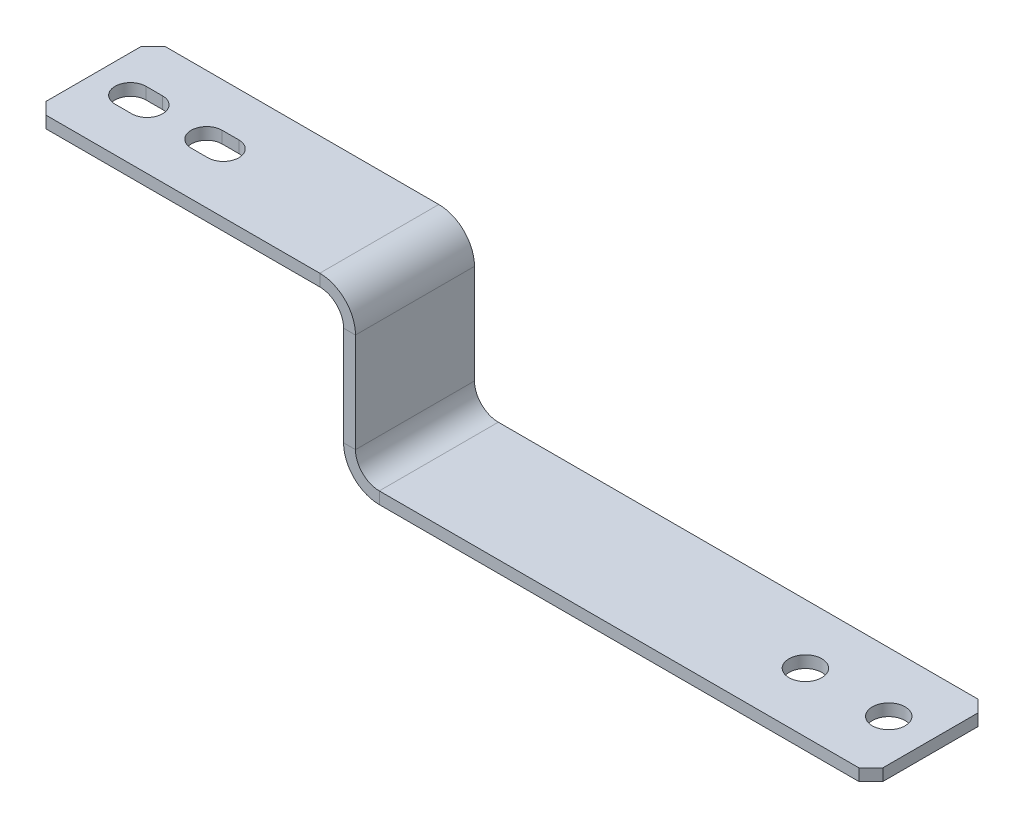
ISO-10303-21;
HEADER;
FILE_DESCRIPTION(('STEP AP214'),'2;1');
FILE_NAME('part.step','',(''),(''),'','','');
FILE_SCHEMA(('AUTOMOTIVE_DESIGN { 1 0 10303 214 1 1 1 1 }'));
ENDSEC;
DATA;
#1=APPLICATION_CONTEXT('core data for automotive mechanical design processes');
#2=APPLICATION_PROTOCOL_DEFINITION('international standard','automotive_design',2000,#1);
#3=PRODUCT_CONTEXT('',#1,'mechanical');
#4=PRODUCT('Part','Part','',(#3));
#5=PRODUCT_RELATED_PRODUCT_CATEGORY('part','',(#4));
#6=PRODUCT_DEFINITION_FORMATION('','',#4);
#7=PRODUCT_DEFINITION_CONTEXT('part definition',#1,'design');
#8=PRODUCT_DEFINITION('design','',#6,#7);
#9=PRODUCT_DEFINITION_SHAPE('','',#8);
#10=(LENGTH_UNIT() NAMED_UNIT(*) SI_UNIT(.MILLI.,.METRE.));
#11=(NAMED_UNIT(*) PLANE_ANGLE_UNIT() SI_UNIT($,.RADIAN.));
#12=(NAMED_UNIT(*) SI_UNIT($,.STERADIAN.) SOLID_ANGLE_UNIT());
#13=UNCERTAINTY_MEASURE_WITH_UNIT(LENGTH_MEASURE(1.E-05),#10,'distance_accuracy_value','');
#14=(GEOMETRIC_REPRESENTATION_CONTEXT(3) GLOBAL_UNCERTAINTY_ASSIGNED_CONTEXT((#13)) GLOBAL_UNIT_ASSIGNED_CONTEXT((#10,
#11,#12)) REPRESENTATION_CONTEXT('',''));
#15=CARTESIAN_POINT('',(0.,0.,0.));
#16=DIRECTION('',(0.,0.,1.));
#17=DIRECTION('',(1.,0.,0.));
#18=AXIS2_PLACEMENT_3D('',#15,#16,#17);
#19=CARTESIAN_POINT('',(-221.5,15.,50.));
#20=DIRECTION('',(0.,0.,1.));
#21=DIRECTION('',(1.,0.,0.));
#22=AXIS2_PLACEMENT_3D('',#19,#20,#21);
#23=PLANE('',#22);
#24=DIRECTION('',(1.,0.,0.));
#25=VECTOR('',#24,1.);
#26=CARTESIAN_POINT('',(-221.5,15.,50.));
#27=LINE('',#26,#25);
#28=CARTESIAN_POINT('',(-221.5,15.,50.));
#29=VERTEX_POINT('',#28);
#30=CARTESIAN_POINT('',(-216.5,15.,50.));
#31=VERTEX_POINT('',#30);
#32=EDGE_CURVE('E385',#29,#31,#27,.T.);
#33=ORIENTED_EDGE('',*,*,#32,.F.);
#34=CARTESIAN_POINT('',(-206.5,15.,50.));
#35=DIRECTION('',(0.,0.,1.));
#36=DIRECTION('',(1.,0.,0.));
#37=AXIS2_PLACEMENT_3D('',#34,#35,#36);
#38=CIRCLE('',#37,15.);
#39=CARTESIAN_POINT('',(-206.5,0.,50.));
#40=VERTEX_POINT('',#39);
#41=EDGE_CURVE('E308',#29,#40,#38,.T.);
#42=ORIENTED_EDGE('',*,*,#41,.T.);
#43=DIRECTION('',(0.,-1.,0.));
#44=VECTOR('',#43,1.);
#45=CARTESIAN_POINT('',(-206.5,4.99999999999997,50.));
#46=LINE('',#45,#44);
#47=CARTESIAN_POINT('',(-206.5,4.99999999999997,50.));
#48=VERTEX_POINT('',#47);
#49=EDGE_CURVE('E383',#48,#40,#46,.T.);
#50=ORIENTED_EDGE('',*,*,#49,.F.);
#51=CARTESIAN_POINT('',(-206.5,15.,50.));
#52=DIRECTION('',(0.,0.,1.));
#53=DIRECTION('',(1.,0.,0.));
#54=AXIS2_PLACEMENT_3D('',#51,#52,#53);
#55=CIRCLE('',#54,10.);
#56=EDGE_CURVE('E289',#31,#48,#55,.T.);
#57=ORIENTED_EDGE('',*,*,#56,.F.);
#58=EDGE_LOOP('',(#33,#42,#50,#57));
#59=FACE_BOUND('',#58,.T.);
#60=ADVANCED_FACE('F45',(#59),#23,.T.);
#61=CARTESIAN_POINT('',(-206.5,4.99999999999997,50.));
#62=DIRECTION('',(0.,0.,1.));
#63=DIRECTION('',(1.,0.,0.));
#64=AXIS2_PLACEMENT_3D('',#61,#62,#63);
#65=PLANE('',#64);
#66=DIRECTION('',(0.,-1.,0.));
#67=VECTOR('',#66,1.);
#68=CARTESIAN_POINT('',(-221.5,0.,50.));
#69=LINE('',#68,#67);
#70=CARTESIAN_POINT('',(-221.5,56.7,50.));
#71=VERTEX_POINT('',#70);
#72=EDGE_CURVE('E305',#71,#29,#69,.T.);
#73=ORIENTED_EDGE('',*,*,#72,.T.);
#74=ORIENTED_EDGE('',*,*,#32,.T.);
#75=DIRECTION('',(0.,1.,0.));
#76=VECTOR('',#75,1.);
#77=CARTESIAN_POINT('',(-216.5,0.,50.));
#78=LINE('',#77,#76);
#79=CARTESIAN_POINT('',(-216.5,56.7,50.));
#80=VERTEX_POINT('',#79);
#81=EDGE_CURVE('E292',#80,#31,#78,.F.);
#82=ORIENTED_EDGE('',*,*,#81,.F.);
#83=DIRECTION('',(-1.,0.,0.));
#84=VECTOR('',#83,1.);
#85=CARTESIAN_POINT('',(-216.5,56.7,50.));
#86=LINE('',#85,#84);
#87=EDGE_CURVE('E374',#80,#71,#86,.T.);
#88=ORIENTED_EDGE('',*,*,#87,.T.);
#89=EDGE_LOOP('',(#73,#74,#82,#88));
#90=FACE_BOUND('',#89,.T.);
#91=ADVANCED_FACE('F490',(#90),#65,.T.);
#92=CARTESIAN_POINT('',(-206.5,0.,0.));
#93=DIRECTION('',(0.,0.,-1.));
#94=DIRECTION('',(-1.,0.,0.));
#95=AXIS2_PLACEMENT_3D('',#92,#93,#94);
#96=PLANE('',#95);
#97=DIRECTION('',(0.,1.,0.));
#98=VECTOR('',#97,1.);
#99=CARTESIAN_POINT('',(-206.5,0.,0.));
#100=LINE('',#99,#98);
#101=CARTESIAN_POINT('',(-206.5,0.,0.));
#102=VERTEX_POINT('',#101);
#103=CARTESIAN_POINT('',(-206.5,4.99999999999997,0.));
#104=VERTEX_POINT('',#103);
#105=EDGE_CURVE('E381',#102,#104,#100,.T.);
#106=ORIENTED_EDGE('',*,*,#105,.F.);
#107=CARTESIAN_POINT('',(-206.5,15.,0.));
#108=DIRECTION('',(0.,0.,1.));
#109=DIRECTION('',(1.,0.,0.));
#110=AXIS2_PLACEMENT_3D('',#107,#108,#109);
#111=CIRCLE('',#110,15.);
#112=CARTESIAN_POINT('',(-221.5,15.,0.));
#113=VERTEX_POINT('',#112);
#114=EDGE_CURVE('E286',#113,#102,#111,.T.);
#115=ORIENTED_EDGE('',*,*,#114,.F.);
#116=DIRECTION('',(-1.,0.,0.));
#117=VECTOR('',#116,1.);
#118=CARTESIAN_POINT('',(-216.5,15.,0.));
#119=LINE('',#118,#117);
#120=CARTESIAN_POINT('',(-216.5,15.,0.));
#121=VERTEX_POINT('',#120);
#122=EDGE_CURVE('E379',#121,#113,#119,.T.);
#123=ORIENTED_EDGE('',*,*,#122,.F.);
#124=CARTESIAN_POINT('',(-206.5,15.,0.));
#125=DIRECTION('',(0.,0.,1.));
#126=DIRECTION('',(1.,0.,0.));
#127=AXIS2_PLACEMENT_3D('',#124,#125,#126);
#128=CIRCLE('',#127,10.);
#129=EDGE_CURVE('E317',#121,#104,#128,.T.);
#130=ORIENTED_EDGE('',*,*,#129,.T.);
#131=EDGE_LOOP('',(#106,#115,#123,#130));
#132=FACE_BOUND('',#131,.T.);
#133=ADVANCED_FACE('F477',(#132),#96,.T.);
#134=CARTESIAN_POINT('',(-216.5,15.,0.));
#135=DIRECTION('',(0.,0.,-1.));
#136=DIRECTION('',(-1.,0.,0.));
#137=AXIS2_PLACEMENT_3D('',#134,#135,#136);
#138=PLANE('',#137);
#139=DIRECTION('',(1.,0.,0.));
#140=VECTOR('',#139,1.);
#141=CARTESIAN_POINT('',(-221.5,4.99999999999997,0.));
#142=LINE('',#141,#140);
#143=CARTESIAN_POINT('',(-5.00000000000003,5.,0.));
#144=VERTEX_POINT('',#143);
#145=EDGE_CURVE('E314',#104,#144,#142,.T.);
#146=ORIENTED_EDGE('',*,*,#145,.T.);
#147=DIRECTION('',(0.,-1.,0.));
#148=VECTOR('',#147,1.);
#149=CARTESIAN_POINT('',(-5.00000000000003,15.,0.));
#150=LINE('',#149,#148);
#151=CARTESIAN_POINT('',(-5.00000000000003,0.,0.));
#152=VERTEX_POINT('',#151);
#153=EDGE_CURVE('E387',#144,#152,#150,.T.);
#154=ORIENTED_EDGE('',*,*,#153,.T.);
#155=DIRECTION('',(1.,0.,0.));
#156=VECTOR('',#155,1.);
#157=CARTESIAN_POINT('',(-221.5,0.,0.));
#158=LINE('',#157,#156);
#159=EDGE_CURVE('E281',#102,#152,#158,.T.);
#160=ORIENTED_EDGE('',*,*,#159,.F.);
#161=ORIENTED_EDGE('',*,*,#105,.T.);
#162=EDGE_LOOP('',(#146,#154,#160,#161));
#163=FACE_BOUND('',#162,.T.);
#164=ADVANCED_FACE('F494',(#163),#138,.T.);
#165=CARTESIAN_POINT('',(-231.5,66.7,50.));
#166=DIRECTION('',(0.,0.,1.));
#167=DIRECTION('',(1.,0.,0.));
#168=AXIS2_PLACEMENT_3D('',#165,#166,#167);
#169=PLANE('',#168);
#170=DIRECTION('',(0.,1.,0.));
#171=VECTOR('',#170,1.);
#172=CARTESIAN_POINT('',(-231.5,66.7,50.));
#173=LINE('',#172,#171);
#174=CARTESIAN_POINT('',(-231.5,66.7,50.));
#175=VERTEX_POINT('',#174);
#176=CARTESIAN_POINT('',(-231.5,71.7,50.));
#177=VERTEX_POINT('',#176);
#178=EDGE_CURVE('E376',#175,#177,#173,.T.);
#179=ORIENTED_EDGE('',*,*,#178,.F.);
#180=CARTESIAN_POINT('',(-231.5,56.7,50.));
#181=DIRECTION('',(0.,0.,-1.));
#182=DIRECTION('',(-1.,0.,0.));
#183=AXIS2_PLACEMENT_3D('',#180,#181,#182);
#184=CIRCLE('',#183,10.);
#185=EDGE_CURVE('E302',#175,#71,#184,.T.);
#186=ORIENTED_EDGE('',*,*,#185,.T.);
#187=ORIENTED_EDGE('',*,*,#87,.F.);
#188=CARTESIAN_POINT('',(-231.5,56.7,50.));
#189=DIRECTION('',(0.,0.,1.));
#190=DIRECTION('',(1.,0.,0.));
#191=AXIS2_PLACEMENT_3D('',#188,#189,#190);
#192=CIRCLE('',#191,15.);
#193=EDGE_CURVE('E295',#177,#80,#192,.F.);
#194=ORIENTED_EDGE('',*,*,#193,.F.);
#195=EDGE_LOOP('',(#179,#186,#187,#194));
#196=FACE_BOUND('',#195,.T.);
#197=ADVANCED_FACE('F492',(#196),#169,.T.);
#198=CARTESIAN_POINT('',(-216.5,56.7,50.));
#199=DIRECTION('',(0.,0.,1.));
#200=DIRECTION('',(1.,0.,0.));
#201=AXIS2_PLACEMENT_3D('',#198,#199,#200);
#202=PLANE('',#201);
#203=DIRECTION('',(1.,0.,0.));
#204=VECTOR('',#203,1.);
#205=CARTESIAN_POINT('',(-221.5,71.7,50.));
#206=LINE('',#205,#204);
#207=CARTESIAN_POINT('',(-346.5,71.7,50.));
#208=VERTEX_POINT('',#207);
#209=EDGE_CURVE('E298',#208,#177,#206,.T.);
#210=ORIENTED_EDGE('',*,*,#209,.F.);
#211=DIRECTION('',(0.,-1.,0.));
#212=VECTOR('',#211,1.);
#213=CARTESIAN_POINT('',(-346.5,56.7,50.));
#214=LINE('',#213,#212);
#215=CARTESIAN_POINT('',(-346.5,66.7,50.));
#216=VERTEX_POINT('',#215);
#217=EDGE_CURVE('E53',#208,#216,#214,.T.);
#218=ORIENTED_EDGE('',*,*,#217,.T.);
#219=DIRECTION('',(1.,0.,0.));
#220=VECTOR('',#219,1.);
#221=CARTESIAN_POINT('',(-221.5,66.7,50.));
#222=LINE('',#221,#220);
#223=EDGE_CURVE('E300',#216,#175,#222,.T.);
#224=ORIENTED_EDGE('',*,*,#223,.T.);
#225=ORIENTED_EDGE('',*,*,#178,.T.);
#226=EDGE_LOOP('',(#210,#218,#224,#225));
#227=FACE_BOUND('',#226,.T.);
#228=ADVANCED_FACE('F426',(#227),#202,.T.);
#229=CARTESIAN_POINT('',(-221.5,56.7,0.));
#230=DIRECTION('',(0.,0.,-1.));
#231=DIRECTION('',(-1.,0.,0.));
#232=AXIS2_PLACEMENT_3D('',#229,#230,#231);
#233=PLANE('',#232);
#234=DIRECTION('',(1.,0.,0.));
#235=VECTOR('',#234,1.);
#236=CARTESIAN_POINT('',(-221.5,56.7,0.));
#237=LINE('',#236,#235);
#238=CARTESIAN_POINT('',(-221.5,56.7,0.));
#239=VERTEX_POINT('',#238);
#240=CARTESIAN_POINT('',(-216.5,56.7,0.));
#241=VERTEX_POINT('',#240);
#242=EDGE_CURVE('E372',#239,#241,#237,.T.);
#243=ORIENTED_EDGE('',*,*,#242,.F.);
#244=CARTESIAN_POINT('',(-231.5,56.7,0.));
#245=DIRECTION('',(0.,0.,-1.));
#246=DIRECTION('',(-1.,0.,0.));
#247=AXIS2_PLACEMENT_3D('',#244,#245,#246);
#248=CIRCLE('',#247,10.);
#249=CARTESIAN_POINT('',(-231.5,66.7,0.));
#250=VERTEX_POINT('',#249);
#251=EDGE_CURVE('E330',#250,#239,#248,.T.);
#252=ORIENTED_EDGE('',*,*,#251,.F.);
#253=DIRECTION('',(0.,-1.,0.));
#254=VECTOR('',#253,1.);
#255=CARTESIAN_POINT('',(-231.5,71.7,0.));
#256=LINE('',#255,#254);
#257=CARTESIAN_POINT('',(-231.5,71.7,0.));
#258=VERTEX_POINT('',#257);
#259=EDGE_CURVE('E369',#258,#250,#256,.T.);
#260=ORIENTED_EDGE('',*,*,#259,.F.);
#261=CARTESIAN_POINT('',(-231.5,56.7,0.));
#262=DIRECTION('',(0.,0.,1.));
#263=DIRECTION('',(1.,0.,0.));
#264=AXIS2_PLACEMENT_3D('',#261,#262,#263);
#265=CIRCLE('',#264,15.);
#266=EDGE_CURVE('E323',#258,#241,#265,.F.);
#267=ORIENTED_EDGE('',*,*,#266,.T.);
#268=EDGE_LOOP('',(#243,#252,#260,#267));
#269=FACE_BOUND('',#268,.T.);
#270=ADVANCED_FACE('F455',(#269),#233,.T.);
#271=CARTESIAN_POINT('',(-231.5,71.7,0.));
#272=DIRECTION('',(0.,0.,-1.));
#273=DIRECTION('',(-1.,0.,0.));
#274=AXIS2_PLACEMENT_3D('',#271,#272,#273);
#275=PLANE('',#274);
#276=DIRECTION('',(0.,-1.,0.));
#277=VECTOR('',#276,1.);
#278=CARTESIAN_POINT('',(-221.5,0.,0.));
#279=LINE('',#278,#277);
#280=EDGE_CURVE('E333',#239,#113,#279,.T.);
#281=ORIENTED_EDGE('',*,*,#280,.F.);
#282=ORIENTED_EDGE('',*,*,#242,.T.);
#283=DIRECTION('',(0.,1.,0.));
#284=VECTOR('',#283,1.);
#285=CARTESIAN_POINT('',(-216.5,0.,0.));
#286=LINE('',#285,#284);
#287=EDGE_CURVE('E320',#241,#121,#286,.F.);
#288=ORIENTED_EDGE('',*,*,#287,.T.);
#289=ORIENTED_EDGE('',*,*,#122,.T.);
#290=EDGE_LOOP('',(#281,#282,#288,#289));
#291=FACE_BOUND('',#290,.T.);
#292=ADVANCED_FACE('F459',(#291),#275,.T.);
#293=CARTESIAN_POINT('',(-221.5,0.,50.));
#294=DIRECTION('',(0.,1.,0.));
#295=DIRECTION('',(-1.,0.,0.));
#296=AXIS2_PLACEMENT_3D('',#293,#294,#295);
#297=PLANE('',#296);
#298=CARTESIAN_POINT('',(-17.5,0.,25.));
#299=DIRECTION('',(0.,1.,0.));
#300=DIRECTION('',(-1.,0.,0.));
#301=AXIS2_PLACEMENT_3D('',#298,#299,#300);
#302=CIRCLE('',#301,6.90000000000001);
#303=CARTESIAN_POINT('',(-24.4,0.,25.));
#304=VERTEX_POINT('',#303);
#305=EDGE_CURVE('E278',#304,#304,#302,.T.);
#306=ORIENTED_EDGE('',*,*,#305,.T.);
#307=EDGE_LOOP('',(#306));
#308=FACE_BOUND('',#307,.T.);
#309=CARTESIAN_POINT('',(-52.5,0.,25.));
#310=DIRECTION('',(0.,1.,0.));
#311=DIRECTION('',(-1.,0.,0.));
#312=AXIS2_PLACEMENT_3D('',#309,#310,#311);
#313=CIRCLE('',#312,6.90000000000001);
#314=CARTESIAN_POINT('',(-59.4,0.,25.));
#315=VERTEX_POINT('',#314);
#316=EDGE_CURVE('E273',#315,#315,#313,.T.);
#317=ORIENTED_EDGE('',*,*,#316,.T.);
#318=EDGE_LOOP('',(#317));
#319=FACE_BOUND('',#318,.T.);
#320=DIRECTION('',(0.,0.,-1.));
#321=VECTOR('',#320,1.);
#322=CARTESIAN_POINT('',(0.,0.,50.));
#323=LINE('',#322,#321);
#324=CARTESIAN_POINT('',(0.,0.,45.));
#325=VERTEX_POINT('',#324);
#326=CARTESIAN_POINT('',(0.,0.,5.00000000000003));
#327=VERTEX_POINT('',#326);
#328=EDGE_CURVE('E367',#325,#327,#323,.T.);
#329=ORIENTED_EDGE('',*,*,#328,.F.);
#330=DIRECTION('',(0.707106781186548,0.,-0.707106781186548));
#331=VECTOR('',#330,1.);
#332=CARTESIAN_POINT('',(0.,0.,45.));
#333=LINE('',#332,#331);
#334=CARTESIAN_POINT('',(-5.00000000000003,0.,50.));
#335=VERTEX_POINT('',#334);
#336=EDGE_CURVE('E401',#325,#335,#333,.F.);
#337=ORIENTED_EDGE('',*,*,#336,.T.);
#338=DIRECTION('',(1.,0.,0.));
#339=VECTOR('',#338,1.);
#340=CARTESIAN_POINT('',(-221.5,0.,50.));
#341=LINE('',#340,#339);
#342=EDGE_CURVE('E282',#40,#335,#341,.T.);
#343=ORIENTED_EDGE('',*,*,#342,.F.);
#344=DIRECTION('',(0.,0.,-1.));
#345=VECTOR('',#344,1.);
#346=CARTESIAN_POINT('',(-206.5,0.,50.));
#347=LINE('',#346,#345);
#348=EDGE_CURVE('E311',#40,#102,#347,.T.);
#349=ORIENTED_EDGE('',*,*,#348,.T.);
#350=ORIENTED_EDGE('',*,*,#159,.T.);
#351=DIRECTION('',(-0.707106781186548,0.,-0.707106781186548));
#352=VECTOR('',#351,1.);
#353=CARTESIAN_POINT('',(-5.00000000000003,0.,0.));
#354=LINE('',#353,#352);
#355=EDGE_CURVE('E390',#152,#327,#354,.F.);
#356=ORIENTED_EDGE('',*,*,#355,.T.);
#357=EDGE_LOOP('',(#329,#337,#343,#349,#350,#356));
#358=FACE_BOUND('',#357,.T.);
#359=ADVANCED_FACE('F581',(#308,#319,#358),#297,.F.);
#360=CARTESIAN_POINT('',(0.,5.,50.));
#361=DIRECTION('',(1.,0.,0.));
#362=DIRECTION('',(0.,0.,-1.));
#363=AXIS2_PLACEMENT_3D('',#360,#361,#362);
#364=PLANE('',#363);
#365=DIRECTION('',(0.,0.,-1.));
#366=VECTOR('',#365,1.);
#367=CARTESIAN_POINT('',(0.,5.,50.));
#368=LINE('',#367,#366);
#369=CARTESIAN_POINT('',(0.,5.,45.));
#370=VERTEX_POINT('',#369);
#371=CARTESIAN_POINT('',(0.,5.,5.00000000000003));
#372=VERTEX_POINT('',#371);
#373=EDGE_CURVE('E365',#370,#372,#368,.T.);
#374=ORIENTED_EDGE('',*,*,#373,.F.);
#375=DIRECTION('',(0.,-1.,0.));
#376=VECTOR('',#375,1.);
#377=CARTESIAN_POINT('',(0.,5.,45.));
#378=LINE('',#377,#376);
#379=EDGE_CURVE('E398',#370,#325,#378,.T.);
#380=ORIENTED_EDGE('',*,*,#379,.T.);
#381=ORIENTED_EDGE('',*,*,#328,.T.);
#382=DIRECTION('',(0.,1.,0.));
#383=VECTOR('',#382,1.);
#384=CARTESIAN_POINT('',(0.,5.,5.00000000000003));
#385=LINE('',#384,#383);
#386=EDGE_CURVE('E393',#327,#372,#385,.T.);
#387=ORIENTED_EDGE('',*,*,#386,.T.);
#388=EDGE_LOOP('',(#374,#380,#381,#387));
#389=FACE_BOUND('',#388,.T.);
#390=ADVANCED_FACE('F577',(#389),#364,.T.);
#391=CARTESIAN_POINT('',(-221.5,4.99999999999997,50.));
#392=DIRECTION('',(0.,1.,0.));
#393=DIRECTION('',(-1.,0.,0.));
#394=AXIS2_PLACEMENT_3D('',#391,#392,#393);
#395=PLANE('',#394);
#396=CARTESIAN_POINT('',(-17.5,5.,25.));
#397=DIRECTION('',(0.,1.,0.));
#398=DIRECTION('',(0.,0.,1.));
#399=AXIS2_PLACEMENT_3D('',#396,#397,#398);
#400=CIRCLE('',#399,6.90000000000001);
#401=CARTESIAN_POINT('',(-17.5,5.,31.9));
#402=VERTEX_POINT('',#401);
#403=EDGE_CURVE('E270',#402,#402,#400,.T.);
#404=ORIENTED_EDGE('',*,*,#403,.F.);
#405=EDGE_LOOP('',(#404));
#406=FACE_BOUND('',#405,.T.);
#407=CARTESIAN_POINT('',(-52.5,5.,25.));
#408=DIRECTION('',(0.,1.,0.));
#409=DIRECTION('',(0.,0.,1.));
#410=AXIS2_PLACEMENT_3D('',#407,#408,#409);
#411=CIRCLE('',#410,6.90000000000001);
#412=CARTESIAN_POINT('',(-52.5,5.,31.9));
#413=VERTEX_POINT('',#412);
#414=EDGE_CURVE('E269',#413,#413,#411,.T.);
#415=ORIENTED_EDGE('',*,*,#414,.F.);
#416=EDGE_LOOP('',(#415));
#417=FACE_BOUND('',#416,.T.);
#418=DIRECTION('',(1.,0.,0.));
#419=VECTOR('',#418,1.);
#420=CARTESIAN_POINT('',(-221.5,4.99999999999997,50.));
#421=LINE('',#420,#419);
#422=CARTESIAN_POINT('',(-5.00000000000003,5.,50.));
#423=VERTEX_POINT('',#422);
#424=EDGE_CURVE('E285',#48,#423,#421,.T.);
#425=ORIENTED_EDGE('',*,*,#424,.T.);
#426=DIRECTION('',(-0.707106781186548,0.,0.707106781186548));
#427=VECTOR('',#426,1.);
#428=CARTESIAN_POINT('',(-113.25,4.99999999999999,158.25));
#429=LINE('',#428,#427);
#430=EDGE_CURVE('E405',#423,#370,#429,.F.);
#431=ORIENTED_EDGE('',*,*,#430,.T.);
#432=ORIENTED_EDGE('',*,*,#373,.T.);
#433=DIRECTION('',(0.707106781186548,0.,0.707106781186548));
#434=VECTOR('',#433,1.);
#435=CARTESIAN_POINT('',(-88.25,4.99999999999999,-83.25));
#436=LINE('',#435,#434);
#437=EDGE_CURVE('E396',#372,#144,#436,.F.);
#438=ORIENTED_EDGE('',*,*,#437,.T.);
#439=ORIENTED_EDGE('',*,*,#145,.F.);
#440=DIRECTION('',(0.,0.,-1.));
#441=VECTOR('',#440,1.);
#442=CARTESIAN_POINT('',(-206.5,4.99999999999997,50.));
#443=LINE('',#442,#441);
#444=EDGE_CURVE('E362',#48,#104,#443,.T.);
#445=ORIENTED_EDGE('',*,*,#444,.F.);
#446=EDGE_LOOP('',(#425,#431,#432,#438,#439,#445));
#447=FACE_BOUND('',#446,.T.);
#448=ADVANCED_FACE('F574',(#406,#417,#447),#395,.T.);
#449=CARTESIAN_POINT('',(-206.5,15.,50.));
#450=DIRECTION('',(0.,0.,-1.));
#451=DIRECTION('',(-1.,0.,0.));
#452=AXIS2_PLACEMENT_3D('',#449,#450,#451);
#453=CYLINDRICAL_SURFACE('',#452,10.);
#454=ORIENTED_EDGE('',*,*,#129,.F.);
#455=DIRECTION('',(0.,0.,-1.));
#456=VECTOR('',#455,1.);
#457=CARTESIAN_POINT('',(-216.5,15.,50.));
#458=LINE('',#457,#456);
#459=EDGE_CURVE('E359',#31,#121,#458,.T.);
#460=ORIENTED_EDGE('',*,*,#459,.F.);
#461=ORIENTED_EDGE('',*,*,#56,.T.);
#462=ORIENTED_EDGE('',*,*,#444,.T.);
#463=EDGE_LOOP('',(#454,#460,#461,#462));
#464=FACE_BOUND('',#463,.T.);
#465=ADVANCED_FACE('F473',(#464),#453,.F.);
#466=CARTESIAN_POINT('',(-216.5,0.,50.));
#467=DIRECTION('',(1.,0.,0.));
#468=DIRECTION('',(0.,0.,-1.));
#469=AXIS2_PLACEMENT_3D('',#466,#467,#468);
#470=PLANE('',#469);
#471=ORIENTED_EDGE('',*,*,#287,.F.);
#472=DIRECTION('',(0.,0.,-1.));
#473=VECTOR('',#472,1.);
#474=CARTESIAN_POINT('',(-216.5,56.7,50.));
#475=LINE('',#474,#473);
#476=EDGE_CURVE('E356',#80,#241,#475,.T.);
#477=ORIENTED_EDGE('',*,*,#476,.F.);
#478=ORIENTED_EDGE('',*,*,#81,.T.);
#479=ORIENTED_EDGE('',*,*,#459,.T.);
#480=EDGE_LOOP('',(#471,#477,#478,#479));
#481=FACE_BOUND('',#480,.T.);
#482=ADVANCED_FACE('F468',(#481),#470,.T.);
#483=CARTESIAN_POINT('',(-231.5,56.7,50.));
#484=DIRECTION('',(0.,0.,-1.));
#485=DIRECTION('',(-1.,0.,0.));
#486=AXIS2_PLACEMENT_3D('',#483,#484,#485);
#487=CYLINDRICAL_SURFACE('',#486,15.);
#488=ORIENTED_EDGE('',*,*,#266,.F.);
#489=DIRECTION('',(0.,0.,-1.));
#490=VECTOR('',#489,1.);
#491=CARTESIAN_POINT('',(-231.5,71.7,50.));
#492=LINE('',#491,#490);
#493=EDGE_CURVE('E353',#177,#258,#492,.T.);
#494=ORIENTED_EDGE('',*,*,#493,.F.);
#495=ORIENTED_EDGE('',*,*,#193,.T.);
#496=ORIENTED_EDGE('',*,*,#476,.T.);
#497=EDGE_LOOP('',(#488,#494,#495,#496));
#498=FACE_BOUND('',#497,.T.);
#499=ADVANCED_FACE('F463',(#498),#487,.T.);
#500=CARTESIAN_POINT('',(-221.5,71.7,50.));
#501=DIRECTION('',(0.,1.,0.));
#502=DIRECTION('',(-1.,0.,0.));
#503=AXIS2_PLACEMENT_3D('',#500,#501,#502);
#504=PLANE('',#503);
#505=CARTESIAN_POINT('',(-329.,71.7,25.));
#506=DIRECTION('',(0.,1.,0.));
#507=DIRECTION('',(-1.,0.,0.));
#508=AXIS2_PLACEMENT_3D('',#505,#506,#507);
#509=CIRCLE('',#508,6.5);
#510=CARTESIAN_POINT('',(-329.,71.7,31.5));
#511=VERTEX_POINT('',#510);
#512=CARTESIAN_POINT('',(-329.,71.7,18.5));
#513=VERTEX_POINT('',#512);
#514=EDGE_CURVE('E267',#511,#513,#509,.T.);
#515=ORIENTED_EDGE('',*,*,#514,.F.);
#516=DIRECTION('',(1.,0.,0.));
#517=VECTOR('',#516,1.);
#518=CARTESIAN_POINT('',(-221.5,71.7,31.5));
#519=LINE('',#518,#517);
#520=CARTESIAN_POINT('',(-336.,71.7,31.5));
#521=VERTEX_POINT('',#520);
#522=EDGE_CURVE('E262',#521,#511,#519,.T.);
#523=ORIENTED_EDGE('',*,*,#522,.F.);
#524=CARTESIAN_POINT('',(-336.,71.7,25.));
#525=DIRECTION('',(0.,1.,0.));
#526=DIRECTION('',(-1.,0.,0.));
#527=AXIS2_PLACEMENT_3D('',#524,#525,#526);
#528=CIRCLE('',#527,6.5);
#529=CARTESIAN_POINT('',(-336.,71.7,18.5));
#530=VERTEX_POINT('',#529);
#531=EDGE_CURVE('E210',#530,#521,#528,.T.);
#532=ORIENTED_EDGE('',*,*,#531,.F.);
#533=DIRECTION('',(-1.,0.,0.));
#534=VECTOR('',#533,1.);
#535=CARTESIAN_POINT('',(-221.5,71.7,18.5000000000001));
#536=LINE('',#535,#534);
#537=EDGE_CURVE('E265',#513,#530,#536,.T.);
#538=ORIENTED_EDGE('',*,*,#537,.F.);
#539=EDGE_LOOP('',(#515,#523,#532,#538));
#540=FACE_BOUND('',#539,.T.);
#541=CARTESIAN_POINT('',(-297.,71.7,25.));
#542=DIRECTION('',(0.,1.,0.));
#543=DIRECTION('',(-1.,0.,0.));
#544=AXIS2_PLACEMENT_3D('',#541,#542,#543);
#545=CIRCLE('',#544,6.5);
#546=CARTESIAN_POINT('',(-297.,71.7,31.5));
#547=VERTEX_POINT('',#546);
#548=CARTESIAN_POINT('',(-297.,71.7,18.5));
#549=VERTEX_POINT('',#548);
#550=EDGE_CURVE('E260',#547,#549,#545,.T.);
#551=ORIENTED_EDGE('',*,*,#550,.F.);
#552=DIRECTION('',(1.,0.,0.));
#553=VECTOR('',#552,1.);
#554=CARTESIAN_POINT('',(-221.5,71.7,31.5));
#555=LINE('',#554,#553);
#556=CARTESIAN_POINT('',(-304.,71.7,31.5));
#557=VERTEX_POINT('',#556);
#558=EDGE_CURVE('E234',#557,#547,#555,.T.);
#559=ORIENTED_EDGE('',*,*,#558,.F.);
#560=CARTESIAN_POINT('',(-304.,71.7,25.));
#561=DIRECTION('',(0.,1.,0.));
#562=DIRECTION('',(-1.,0.,0.));
#563=AXIS2_PLACEMENT_3D('',#560,#561,#562);
#564=CIRCLE('',#563,6.5);
#565=CARTESIAN_POINT('',(-304.,71.7,18.5));
#566=VERTEX_POINT('',#565);
#567=EDGE_CURVE('E256',#566,#557,#564,.T.);
#568=ORIENTED_EDGE('',*,*,#567,.F.);
#569=DIRECTION('',(-1.,0.,0.));
#570=VECTOR('',#569,1.);
#571=CARTESIAN_POINT('',(-221.5,71.7,18.5));
#572=LINE('',#571,#570);
#573=EDGE_CURVE('E258',#549,#566,#572,.T.);
#574=ORIENTED_EDGE('',*,*,#573,.F.);
#575=EDGE_LOOP('',(#551,#559,#568,#574));
#576=FACE_BOUND('',#575,.T.);
#577=DIRECTION('',(0.,0.,-1.));
#578=VECTOR('',#577,1.);
#579=CARTESIAN_POINT('',(-351.5,71.7,50.));
#580=LINE('',#579,#578);
#581=CARTESIAN_POINT('',(-351.5,71.7,45.));
#582=VERTEX_POINT('',#581);
#583=CARTESIAN_POINT('',(-351.5,71.7,5.00000000000003));
#584=VERTEX_POINT('',#583);
#585=EDGE_CURVE('E351',#582,#584,#580,.T.);
#586=ORIENTED_EDGE('',*,*,#585,.F.);
#587=DIRECTION('',(-0.707106781186549,0.,-0.707106781186546));
#588=VECTOR('',#587,1.);
#589=CARTESIAN_POINT('',(-284.,71.7,112.5));
#590=LINE('',#589,#588);
#591=EDGE_CURVE('E421',#582,#208,#590,.F.);
#592=ORIENTED_EDGE('',*,*,#591,.T.);
#593=ORIENTED_EDGE('',*,*,#209,.T.);
#594=ORIENTED_EDGE('',*,*,#493,.T.);
#595=DIRECTION('',(1.,0.,0.));
#596=VECTOR('',#595,1.);
#597=CARTESIAN_POINT('',(-221.5,71.7,0.));
#598=LINE('',#597,#596);
#599=CARTESIAN_POINT('',(-346.5,71.7,0.));
#600=VERTEX_POINT('',#599);
#601=EDGE_CURVE('E326',#600,#258,#598,.T.);
#602=ORIENTED_EDGE('',*,*,#601,.F.);
#603=DIRECTION('',(-0.707106781186549,0.,0.707106781186546));
#604=VECTOR('',#603,1.);
#605=CARTESIAN_POINT('',(-309.,71.7,-37.5000000000001));
#606=LINE('',#605,#604);
#607=EDGE_CURVE('E410',#600,#584,#606,.T.);
#608=ORIENTED_EDGE('',*,*,#607,.T.);
#609=EDGE_LOOP('',(#586,#592,#593,#594,#602,#608));
#610=FACE_BOUND('',#609,.T.);
#611=ADVANCED_FACE('F439',(#540,#576,#610),#504,.T.);
#612=CARTESIAN_POINT('',(-351.5,66.7,50.));
#613=DIRECTION('',(-1.,0.,0.));
#614=DIRECTION('',(0.,0.,1.));
#615=AXIS2_PLACEMENT_3D('',#612,#613,#614);
#616=PLANE('',#615);
#617=DIRECTION('',(0.,0.,-1.));
#618=VECTOR('',#617,1.);
#619=CARTESIAN_POINT('',(-351.5,66.7,50.));
#620=LINE('',#619,#618);
#621=CARTESIAN_POINT('',(-351.5,66.7,45.));
#622=VERTEX_POINT('',#621);
#623=CARTESIAN_POINT('',(-351.5,66.7,5.00000000000003));
#624=VERTEX_POINT('',#623);
#625=EDGE_CURVE('E349',#622,#624,#620,.T.);
#626=ORIENTED_EDGE('',*,*,#625,.F.);
#627=DIRECTION('',(0.,1.,0.));
#628=VECTOR('',#627,1.);
#629=CARTESIAN_POINT('',(-351.5,66.7,45.));
#630=LINE('',#629,#628);
#631=EDGE_CURVE('E418',#622,#582,#630,.T.);
#632=ORIENTED_EDGE('',*,*,#631,.T.);
#633=ORIENTED_EDGE('',*,*,#585,.T.);
#634=DIRECTION('',(0.,-1.,0.));
#635=VECTOR('',#634,1.);
#636=CARTESIAN_POINT('',(-351.5,66.7,5.00000000000003));
#637=LINE('',#636,#635);
#638=EDGE_CURVE('E413',#584,#624,#637,.T.);
#639=ORIENTED_EDGE('',*,*,#638,.T.);
#640=EDGE_LOOP('',(#626,#632,#633,#639));
#641=FACE_BOUND('',#640,.T.);
#642=ADVANCED_FACE('F437',(#641),#616,.T.);
#643=CARTESIAN_POINT('',(-221.5,66.7,50.));
#644=DIRECTION('',(0.,1.,0.));
#645=DIRECTION('',(-1.,0.,0.));
#646=AXIS2_PLACEMENT_3D('',#643,#644,#645);
#647=PLANE('',#646);
#648=DIRECTION('',(-1.,0.,0.));
#649=VECTOR('',#648,1.);
#650=CARTESIAN_POINT('',(-329.,66.6999999999999,31.5));
#651=LINE('',#650,#649);
#652=CARTESIAN_POINT('',(-329.,66.7,31.5));
#653=VERTEX_POINT('',#652);
#654=CARTESIAN_POINT('',(-336.,66.6999999999999,31.5));
#655=VERTEX_POINT('',#654);
#656=EDGE_CURVE('E217',#653,#655,#651,.T.);
#657=ORIENTED_EDGE('',*,*,#656,.F.);
#658=CARTESIAN_POINT('',(-329.,66.6999999999999,25.));
#659=DIRECTION('',(0.,-1.,0.));
#660=DIRECTION('',(1.,0.,0.));
#661=AXIS2_PLACEMENT_3D('',#658,#659,#660);
#662=CIRCLE('',#661,6.5);
#663=CARTESIAN_POINT('',(-329.,66.6999999999999,18.5));
#664=VERTEX_POINT('',#663);
#665=EDGE_CURVE('E222',#664,#653,#662,.T.);
#666=ORIENTED_EDGE('',*,*,#665,.F.);
#667=DIRECTION('',(1.,0.,0.));
#668=VECTOR('',#667,1.);
#669=CARTESIAN_POINT('',(-329.,66.6999999999999,18.5));
#670=LINE('',#669,#668);
#671=CARTESIAN_POINT('',(-336.,66.6999999999999,18.5));
#672=VERTEX_POINT('',#671);
#673=EDGE_CURVE('E227',#672,#664,#670,.T.);
#674=ORIENTED_EDGE('',*,*,#673,.F.);
#675=CARTESIAN_POINT('',(-336.,66.6999999999999,25.));
#676=DIRECTION('',(0.,-1.,0.));
#677=DIRECTION('',(1.,0.,0.));
#678=AXIS2_PLACEMENT_3D('',#675,#676,#677);
#679=CIRCLE('',#678,6.5);
#680=EDGE_CURVE('E207',#655,#672,#679,.T.);
#681=ORIENTED_EDGE('',*,*,#680,.F.);
#682=EDGE_LOOP('',(#657,#666,#674,#681));
#683=FACE_BOUND('',#682,.T.);
#684=DIRECTION('',(-1.,0.,0.));
#685=VECTOR('',#684,1.);
#686=CARTESIAN_POINT('',(-297.,66.6999999999999,31.5));
#687=LINE('',#686,#685);
#688=CARTESIAN_POINT('',(-297.,66.7,31.5));
#689=VERTEX_POINT('',#688);
#690=CARTESIAN_POINT('',(-304.,66.6999999999999,31.5));
#691=VERTEX_POINT('',#690);
#692=EDGE_CURVE('E239',#689,#691,#687,.T.);
#693=ORIENTED_EDGE('',*,*,#692,.F.);
#694=CARTESIAN_POINT('',(-297.,66.6999999999999,25.));
#695=DIRECTION('',(0.,-1.,0.));
#696=DIRECTION('',(1.,0.,0.));
#697=AXIS2_PLACEMENT_3D('',#694,#695,#696);
#698=CIRCLE('',#697,6.5);
#699=CARTESIAN_POINT('',(-297.,66.6999999999999,18.5));
#700=VERTEX_POINT('',#699);
#701=EDGE_CURVE('E237',#700,#689,#698,.T.);
#702=ORIENTED_EDGE('',*,*,#701,.F.);
#703=DIRECTION('',(1.,0.,0.));
#704=VECTOR('',#703,1.);
#705=CARTESIAN_POINT('',(-297.,66.6999999999999,18.5));
#706=LINE('',#705,#704);
#707=CARTESIAN_POINT('',(-304.,66.6999999999999,18.5));
#708=VERTEX_POINT('',#707);
#709=EDGE_CURVE('E244',#708,#700,#706,.T.);
#710=ORIENTED_EDGE('',*,*,#709,.F.);
#711=CARTESIAN_POINT('',(-304.,66.6999999999999,25.));
#712=DIRECTION('',(0.,-1.,0.));
#713=DIRECTION('',(1.,0.,0.));
#714=AXIS2_PLACEMENT_3D('',#711,#712,#713);
#715=CIRCLE('',#714,6.5);
#716=EDGE_CURVE('E241',#691,#708,#715,.T.);
#717=ORIENTED_EDGE('',*,*,#716,.F.);
#718=EDGE_LOOP('',(#693,#702,#710,#717));
#719=FACE_BOUND('',#718,.T.);
#720=ORIENTED_EDGE('',*,*,#223,.F.);
#721=DIRECTION('',(0.707106781186549,0.,0.707106781186546));
#722=VECTOR('',#721,1.);
#723=CARTESIAN_POINT('',(-351.5,66.7,45.));
#724=LINE('',#723,#722);
#725=EDGE_CURVE('E11',#216,#622,#724,.F.);
#726=ORIENTED_EDGE('',*,*,#725,.T.);
#727=ORIENTED_EDGE('',*,*,#625,.T.);
#728=DIRECTION('',(0.707106781186549,0.,-0.707106781186546));
#729=VECTOR('',#728,1.);
#730=CARTESIAN_POINT('',(-346.5,66.7,0.));
#731=LINE('',#730,#729);
#732=CARTESIAN_POINT('',(-346.5,66.7,0.));
#733=VERTEX_POINT('',#732);
#734=EDGE_CURVE('E416',#624,#733,#731,.T.);
#735=ORIENTED_EDGE('',*,*,#734,.T.);
#736=DIRECTION('',(1.,0.,0.));
#737=VECTOR('',#736,1.);
#738=CARTESIAN_POINT('',(-221.5,66.7,0.));
#739=LINE('',#738,#737);
#740=EDGE_CURVE('E328',#733,#250,#739,.T.);
#741=ORIENTED_EDGE('',*,*,#740,.T.);
#742=DIRECTION('',(0.,0.,-1.));
#743=VECTOR('',#742,1.);
#744=CARTESIAN_POINT('',(-231.5,66.7,50.));
#745=LINE('',#744,#743);
#746=EDGE_CURVE('E346',#175,#250,#745,.T.);
#747=ORIENTED_EDGE('',*,*,#746,.F.);
#748=EDGE_LOOP('',(#720,#726,#727,#735,#741,#747));
#749=FACE_BOUND('',#748,.T.);
#750=ADVANCED_FACE('F224',(#683,#719,#749),#647,.F.);
#751=CARTESIAN_POINT('',(-231.5,56.7,50.));
#752=DIRECTION('',(0.,0.,-1.));
#753=DIRECTION('',(-1.,0.,0.));
#754=AXIS2_PLACEMENT_3D('',#751,#752,#753);
#755=CYLINDRICAL_SURFACE('',#754,10.);
#756=ORIENTED_EDGE('',*,*,#251,.T.);
#757=DIRECTION('',(0.,0.,-1.));
#758=VECTOR('',#757,1.);
#759=CARTESIAN_POINT('',(-221.5,56.7,50.));
#760=LINE('',#759,#758);
#761=EDGE_CURVE('E343',#71,#239,#760,.T.);
#762=ORIENTED_EDGE('',*,*,#761,.F.);
#763=ORIENTED_EDGE('',*,*,#185,.F.);
#764=ORIENTED_EDGE('',*,*,#746,.T.);
#765=EDGE_LOOP('',(#756,#762,#763,#764));
#766=FACE_BOUND('',#765,.T.);
#767=ADVANCED_FACE('F453',(#766),#755,.F.);
#768=CARTESIAN_POINT('',(-221.5,0.,50.));
#769=DIRECTION('',(1.,0.,0.));
#770=DIRECTION('',(0.,0.,-1.));
#771=AXIS2_PLACEMENT_3D('',#768,#769,#770);
#772=PLANE('',#771);
#773=ORIENTED_EDGE('',*,*,#280,.T.);
#774=DIRECTION('',(0.,0.,-1.));
#775=VECTOR('',#774,1.);
#776=CARTESIAN_POINT('',(-221.5,15.,50.));
#777=LINE('',#776,#775);
#778=EDGE_CURVE('E340',#29,#113,#777,.T.);
#779=ORIENTED_EDGE('',*,*,#778,.F.);
#780=ORIENTED_EDGE('',*,*,#72,.F.);
#781=ORIENTED_EDGE('',*,*,#761,.T.);
#782=EDGE_LOOP('',(#773,#779,#780,#781));
#783=FACE_BOUND('',#782,.T.);
#784=ADVANCED_FACE('F481',(#783),#772,.F.);
#785=CARTESIAN_POINT('',(-206.5,15.,50.));
#786=DIRECTION('',(0.,0.,-1.));
#787=DIRECTION('',(-1.,0.,0.));
#788=AXIS2_PLACEMENT_3D('',#785,#786,#787);
#789=CYLINDRICAL_SURFACE('',#788,15.);
#790=ORIENTED_EDGE('',*,*,#114,.T.);
#791=ORIENTED_EDGE('',*,*,#348,.F.);
#792=ORIENTED_EDGE('',*,*,#41,.F.);
#793=ORIENTED_EDGE('',*,*,#778,.T.);
#794=EDGE_LOOP('',(#790,#791,#792,#793));
#795=FACE_BOUND('',#794,.T.);
#796=ADVANCED_FACE('F485',(#795),#789,.T.);
#797=CARTESIAN_POINT('',(-206.5,15.,50.));
#798=DIRECTION('',(0.,0.,1.));
#799=DIRECTION('',(1.,0.,0.));
#800=AXIS2_PLACEMENT_3D('',#797,#798,#799);
#801=PLANE('',#800);
#802=ORIENTED_EDGE('',*,*,#342,.T.);
#803=DIRECTION('',(0.,1.,0.));
#804=VECTOR('',#803,1.);
#805=CARTESIAN_POINT('',(-5.00000000000003,15.,50.));
#806=LINE('',#805,#804);
#807=EDGE_CURVE('E403',#335,#423,#806,.T.);
#808=ORIENTED_EDGE('',*,*,#807,.T.);
#809=ORIENTED_EDGE('',*,*,#424,.F.);
#810=ORIENTED_EDGE('',*,*,#49,.T.);
#811=EDGE_LOOP('',(#802,#808,#809,#810));
#812=FACE_BOUND('',#811,.T.);
#813=ADVANCED_FACE('F551',(#812),#801,.T.);
#814=CARTESIAN_POINT('',(-206.5,15.,0.));
#815=DIRECTION('',(0.,0.,1.));
#816=DIRECTION('',(1.,0.,0.));
#817=AXIS2_PLACEMENT_3D('',#814,#815,#816);
#818=PLANE('',#817);
#819=ORIENTED_EDGE('',*,*,#740,.F.);
#820=DIRECTION('',(0.,1.,0.));
#821=VECTOR('',#820,1.);
#822=CARTESIAN_POINT('',(-346.5,71.7,0.));
#823=LINE('',#822,#821);
#824=EDGE_CURVE('E407',#733,#600,#823,.T.);
#825=ORIENTED_EDGE('',*,*,#824,.T.);
#826=ORIENTED_EDGE('',*,*,#601,.T.);
#827=ORIENTED_EDGE('',*,*,#259,.T.);
#828=EDGE_LOOP('',(#819,#825,#826,#827));
#829=FACE_BOUND('',#828,.T.);
#830=ADVANCED_FACE('F448',(#829),#818,.F.);
#831=CARTESIAN_POINT('',(-52.5,-1.,25.));
#832=DIRECTION('',(0.,1.,0.));
#833=DIRECTION('',(0.,0.,1.));
#834=AXIS2_PLACEMENT_3D('',#831,#832,#833);
#835=CYLINDRICAL_SURFACE('',#834,6.90000000000001);
#836=ORIENTED_EDGE('',*,*,#414,.T.);
#837=EDGE_LOOP('',(#836));
#838=FACE_BOUND('',#837,.T.);
#839=ORIENTED_EDGE('',*,*,#316,.F.);
#840=EDGE_LOOP('',(#839));
#841=FACE_BOUND('',#840,.T.);
#842=ADVANCED_FACE('F546',(#838,#841),#835,.F.);
#843=CARTESIAN_POINT('',(-17.5,-1.,25.));
#844=DIRECTION('',(0.,1.,0.));
#845=DIRECTION('',(0.,0.,1.));
#846=AXIS2_PLACEMENT_3D('',#843,#844,#845);
#847=CYLINDRICAL_SURFACE('',#846,6.90000000000001);
#848=ORIENTED_EDGE('',*,*,#403,.T.);
#849=EDGE_LOOP('',(#848));
#850=FACE_BOUND('',#849,.T.);
#851=ORIENTED_EDGE('',*,*,#305,.F.);
#852=EDGE_LOOP('',(#851));
#853=FACE_BOUND('',#852,.T.);
#854=ADVANCED_FACE('F517',(#850,#853),#847,.F.);
#855=CARTESIAN_POINT('',(-5.00000000000003,15.,0.));
#856=DIRECTION('',(-0.707106781186547,0.,0.707106781186547));
#857=DIRECTION('',(0.,-1.,0.));
#858=AXIS2_PLACEMENT_3D('',#855,#856,#857);
#859=PLANE('',#858);
#860=ORIENTED_EDGE('',*,*,#437,.F.);
#861=ORIENTED_EDGE('',*,*,#386,.F.);
#862=ORIENTED_EDGE('',*,*,#355,.F.);
#863=ORIENTED_EDGE('',*,*,#153,.F.);
#864=EDGE_LOOP('',(#860,#861,#862,#863));
#865=FACE_BOUND('',#864,.T.);
#866=ADVANCED_FACE('F513',(#865),#859,.F.);
#867=CARTESIAN_POINT('',(0.,5.,45.));
#868=DIRECTION('',(-0.707106781186547,0.,-0.707106781186547));
#869=DIRECTION('',(0.,-1.,0.));
#870=AXIS2_PLACEMENT_3D('',#867,#868,#869);
#871=PLANE('',#870);
#872=ORIENTED_EDGE('',*,*,#430,.F.);
#873=ORIENTED_EDGE('',*,*,#807,.F.);
#874=ORIENTED_EDGE('',*,*,#336,.F.);
#875=ORIENTED_EDGE('',*,*,#379,.F.);
#876=EDGE_LOOP('',(#872,#873,#874,#875));
#877=FACE_BOUND('',#876,.T.);
#878=ADVANCED_FACE('F516',(#877),#871,.F.);
#879=CARTESIAN_POINT('',(-346.5,15.,0.));
#880=DIRECTION('',(-0.707106781186546,0.,-0.707106781186549));
#881=DIRECTION('',(0.,-1.,0.));
#882=AXIS2_PLACEMENT_3D('',#879,#880,#881);
#883=PLANE('',#882);
#884=ORIENTED_EDGE('',*,*,#734,.F.);
#885=ORIENTED_EDGE('',*,*,#638,.F.);
#886=ORIENTED_EDGE('',*,*,#607,.F.);
#887=ORIENTED_EDGE('',*,*,#824,.F.);
#888=EDGE_LOOP('',(#884,#885,#886,#887));
#889=FACE_BOUND('',#888,.T.);
#890=ADVANCED_FACE('F445',(#889),#883,.T.);
#891=CARTESIAN_POINT('',(-351.5,66.7,45.));
#892=DIRECTION('',(0.707106781186546,0.,-0.707106781186549));
#893=DIRECTION('',(0.,1.,0.));
#894=AXIS2_PLACEMENT_3D('',#891,#892,#893);
#895=PLANE('',#894);
#896=ORIENTED_EDGE('',*,*,#725,.F.);
#897=ORIENTED_EDGE('',*,*,#217,.F.);
#898=ORIENTED_EDGE('',*,*,#591,.F.);
#899=ORIENTED_EDGE('',*,*,#631,.F.);
#900=EDGE_LOOP('',(#896,#897,#898,#899));
#901=FACE_BOUND('',#900,.T.);
#902=ADVANCED_FACE('F47',(#901),#895,.F.);
#903=CARTESIAN_POINT('',(-297.,76.6999999999999,25.));
#904=DIRECTION('',(0.,-1.,0.));
#905=DIRECTION('',(1.,0.,0.));
#906=AXIS2_PLACEMENT_3D('',#903,#904,#905);
#907=CYLINDRICAL_SURFACE('',#906,6.5);
#908=ORIENTED_EDGE('',*,*,#550,.T.);
#909=DIRECTION('',(0.,-1.,0.));
#910=VECTOR('',#909,1.);
#911=CARTESIAN_POINT('',(-297.,76.6999999999999,18.5));
#912=LINE('',#911,#910);
#913=EDGE_CURVE('E248',#549,#700,#912,.T.);
#914=ORIENTED_EDGE('',*,*,#913,.T.);
#915=ORIENTED_EDGE('',*,*,#701,.T.);
#916=DIRECTION('',(0.,-1.,0.));
#917=VECTOR('',#916,1.);
#918=CARTESIAN_POINT('',(-297.,76.6999999999999,31.5));
#919=LINE('',#918,#917);
#920=EDGE_CURVE('E247',#547,#689,#919,.T.);
#921=ORIENTED_EDGE('',*,*,#920,.F.);
#922=EDGE_LOOP('',(#908,#914,#915,#921));
#923=FACE_BOUND('',#922,.T.);
#924=ADVANCED_FACE('F525',(#923),#907,.F.);
#925=CARTESIAN_POINT('',(-297.,76.6999999999999,18.5));
#926=DIRECTION('',(0.,0.,-1.));
#927=DIRECTION('',(-1.,0.,0.));
#928=AXIS2_PLACEMENT_3D('',#925,#926,#927);
#929=PLANE('',#928);
#930=ORIENTED_EDGE('',*,*,#573,.T.);
#931=DIRECTION('',(0.,-1.,0.));
#932=VECTOR('',#931,1.);
#933=CARTESIAN_POINT('',(-304.,76.6999999999999,18.5));
#934=LINE('',#933,#932);
#935=EDGE_CURVE('E250',#566,#708,#934,.T.);
#936=ORIENTED_EDGE('',*,*,#935,.T.);
#937=ORIENTED_EDGE('',*,*,#709,.T.);
#938=ORIENTED_EDGE('',*,*,#913,.F.);
#939=EDGE_LOOP('',(#930,#936,#937,#938));
#940=FACE_BOUND('',#939,.T.);
#941=ADVANCED_FACE('F530',(#940),#929,.F.);
#942=CARTESIAN_POINT('',(-304.,76.6999999999999,25.));
#943=DIRECTION('',(0.,-1.,0.));
#944=DIRECTION('',(1.,0.,0.));
#945=AXIS2_PLACEMENT_3D('',#942,#943,#944);
#946=CYLINDRICAL_SURFACE('',#945,6.5);
#947=ORIENTED_EDGE('',*,*,#567,.T.);
#948=DIRECTION('',(0.,-1.,0.));
#949=VECTOR('',#948,1.);
#950=CARTESIAN_POINT('',(-304.,76.6999999999999,31.5));
#951=LINE('',#950,#949);
#952=EDGE_CURVE('E68',#557,#691,#951,.T.);
#953=ORIENTED_EDGE('',*,*,#952,.T.);
#954=ORIENTED_EDGE('',*,*,#716,.T.);
#955=ORIENTED_EDGE('',*,*,#935,.F.);
#956=EDGE_LOOP('',(#947,#953,#954,#955));
#957=FACE_BOUND('',#956,.T.);
#958=ADVANCED_FACE('F537',(#957),#946,.F.);
#959=CARTESIAN_POINT('',(-297.,76.6999999999999,31.5));
#960=DIRECTION('',(0.,0.,1.));
#961=DIRECTION('',(1.,0.,0.));
#962=AXIS2_PLACEMENT_3D('',#959,#960,#961);
#963=PLANE('',#962);
#964=ORIENTED_EDGE('',*,*,#558,.T.);
#965=ORIENTED_EDGE('',*,*,#920,.T.);
#966=ORIENTED_EDGE('',*,*,#692,.T.);
#967=ORIENTED_EDGE('',*,*,#952,.F.);
#968=EDGE_LOOP('',(#964,#965,#966,#967));
#969=FACE_BOUND('',#968,.T.);
#970=ADVANCED_FACE('F542',(#969),#963,.F.);
#971=CARTESIAN_POINT('',(-329.,76.6999999999999,25.));
#972=DIRECTION('',(0.,-1.,0.));
#973=DIRECTION('',(1.,0.,0.));
#974=AXIS2_PLACEMENT_3D('',#971,#972,#973);
#975=CYLINDRICAL_SURFACE('',#974,6.5);
#976=ORIENTED_EDGE('',*,*,#514,.T.);
#977=DIRECTION('',(0.,-1.,0.));
#978=VECTOR('',#977,1.);
#979=CARTESIAN_POINT('',(-329.,76.6999999999999,18.5));
#980=LINE('',#979,#978);
#981=EDGE_CURVE('E232',#513,#664,#980,.T.);
#982=ORIENTED_EDGE('',*,*,#981,.T.);
#983=ORIENTED_EDGE('',*,*,#665,.T.);
#984=DIRECTION('',(0.,-1.,0.));
#985=VECTOR('',#984,1.);
#986=CARTESIAN_POINT('',(-329.,76.6999999999999,31.5));
#987=LINE('',#986,#985);
#988=EDGE_CURVE('E213',#511,#653,#987,.T.);
#989=ORIENTED_EDGE('',*,*,#988,.F.);
#990=EDGE_LOOP('',(#976,#982,#983,#989));
#991=FACE_BOUND('',#990,.T.);
#992=ADVANCED_FACE('F730',(#991),#975,.F.);
#993=CARTESIAN_POINT('',(-329.,76.6999999999999,18.5));
#994=DIRECTION('',(0.,0.,-1.));
#995=DIRECTION('',(-1.,0.,0.));
#996=AXIS2_PLACEMENT_3D('',#993,#994,#995);
#997=PLANE('',#996);
#998=ORIENTED_EDGE('',*,*,#537,.T.);
#999=DIRECTION('',(0.,-1.,0.));
#1000=VECTOR('',#999,1.);
#1001=CARTESIAN_POINT('',(-336.,76.6999999999999,18.5));
#1002=LINE('',#1001,#1000);
#1003=EDGE_CURVE('E212',#530,#672,#1002,.T.);
#1004=ORIENTED_EDGE('',*,*,#1003,.T.);
#1005=ORIENTED_EDGE('',*,*,#673,.T.);
#1006=ORIENTED_EDGE('',*,*,#981,.F.);
#1007=EDGE_LOOP('',(#998,#1004,#1005,#1006));
#1008=FACE_BOUND('',#1007,.T.);
#1009=ADVANCED_FACE('F739',(#1008),#997,.F.);
#1010=CARTESIAN_POINT('',(-336.,76.6999999999999,25.));
#1011=DIRECTION('',(0.,-1.,0.));
#1012=DIRECTION('',(1.,0.,0.));
#1013=AXIS2_PLACEMENT_3D('',#1010,#1011,#1012);
#1014=CYLINDRICAL_SURFACE('',#1013,6.5);
#1015=ORIENTED_EDGE('',*,*,#531,.T.);
#1016=DIRECTION('',(0.,-1.,0.));
#1017=VECTOR('',#1016,1.);
#1018=CARTESIAN_POINT('',(-336.,76.6999999999999,31.5));
#1019=LINE('',#1018,#1017);
#1020=EDGE_CURVE('E60',#521,#655,#1019,.T.);
#1021=ORIENTED_EDGE('',*,*,#1020,.T.);
#1022=ORIENTED_EDGE('',*,*,#680,.T.);
#1023=ORIENTED_EDGE('',*,*,#1003,.F.);
#1024=EDGE_LOOP('',(#1015,#1021,#1022,#1023));
#1025=FACE_BOUND('',#1024,.T.);
#1026=ADVANCED_FACE('F204',(#1025),#1014,.F.);
#1027=CARTESIAN_POINT('',(-329.,76.6999999999999,31.5));
#1028=DIRECTION('',(0.,0.,1.));
#1029=DIRECTION('',(1.,0.,0.));
#1030=AXIS2_PLACEMENT_3D('',#1027,#1028,#1029);
#1031=PLANE('',#1030);
#1032=ORIENTED_EDGE('',*,*,#522,.T.);
#1033=ORIENTED_EDGE('',*,*,#988,.T.);
#1034=ORIENTED_EDGE('',*,*,#656,.T.);
#1035=ORIENTED_EDGE('',*,*,#1020,.F.);
#1036=EDGE_LOOP('',(#1032,#1033,#1034,#1035));
#1037=FACE_BOUND('',#1036,.T.);
#1038=ADVANCED_FACE('F218',(#1037),#1031,.F.);
#1039=CLOSED_SHELL('',(#60,#91,#133,#164,#197,#228,#270,#292,#359,#390,#448,#465,#482,#499,#611,
#642,#750,#767,#784,#796,#813,#830,#842,#854,#866,#878,#890,#902,#924,#941,#958,#970,#992,#1009,
#1026,#1038));
#1040=MANIFOLD_SOLID_BREP('B2',#1039);
#1041=ADVANCED_BREP_SHAPE_REPRESENTATION('',(#18,#1040),#14);
#1042=SHAPE_DEFINITION_REPRESENTATION(#9,#1041);
ENDSEC;
END-ISO-10303-21;
